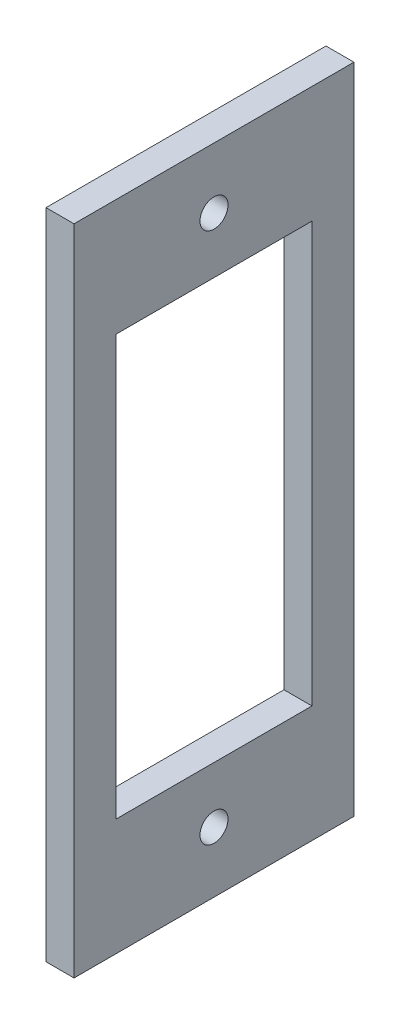
ISO-10303-21;
HEADER;
FILE_DESCRIPTION(('STEP AP214'),'2;1');
FILE_NAME('part.step','',(''),(''),'','','');
FILE_SCHEMA(('AUTOMOTIVE_DESIGN { 1 0 10303 214 1 1 1 1 }'));
ENDSEC;
DATA;
#1=APPLICATION_CONTEXT('core data for automotive mechanical design processes');
#2=APPLICATION_PROTOCOL_DEFINITION('international standard','automotive_design',2000,#1);
#3=PRODUCT_CONTEXT('',#1,'mechanical');
#4=PRODUCT('Part','Part','',(#3));
#5=PRODUCT_RELATED_PRODUCT_CATEGORY('part','',(#4));
#6=PRODUCT_DEFINITION_FORMATION('','',#4);
#7=PRODUCT_DEFINITION_CONTEXT('part definition',#1,'design');
#8=PRODUCT_DEFINITION('design','',#6,#7);
#9=PRODUCT_DEFINITION_SHAPE('','',#8);
#10=(LENGTH_UNIT() NAMED_UNIT(*) SI_UNIT(.MILLI.,.METRE.));
#11=(NAMED_UNIT(*) PLANE_ANGLE_UNIT() SI_UNIT($,.RADIAN.));
#12=(NAMED_UNIT(*) SI_UNIT($,.STERADIAN.) SOLID_ANGLE_UNIT());
#13=UNCERTAINTY_MEASURE_WITH_UNIT(LENGTH_MEASURE(1.E-05),#10,'distance_accuracy_value','');
#14=(GEOMETRIC_REPRESENTATION_CONTEXT(3) GLOBAL_UNCERTAINTY_ASSIGNED_CONTEXT((#13)) GLOBAL_UNIT_ASSIGNED_CONTEXT((#10,
#11,#12)) REPRESENTATION_CONTEXT('',''));
#15=CARTESIAN_POINT('',(0.,0.,0.));
#16=DIRECTION('',(0.,0.,1.));
#17=DIRECTION('',(1.,0.,0.));
#18=AXIS2_PLACEMENT_3D('',#15,#16,#17);
#19=CARTESIAN_POINT('',(3.,-35.,15.));
#20=DIRECTION('',(0.,0.,-1.));
#21=DIRECTION('',(-1.,0.,0.));
#22=AXIS2_PLACEMENT_3D('',#19,#20,#21);
#23=PLANE('',#22);
#24=DIRECTION('',(0.,-1.,0.));
#25=VECTOR('',#24,1.);
#26=CARTESIAN_POINT('',(0.,-35.,15.));
#27=LINE('',#26,#25);
#28=CARTESIAN_POINT('',(0.,35.,15.));
#29=VERTEX_POINT('',#28);
#30=CARTESIAN_POINT('',(0.,-35.,15.));
#31=VERTEX_POINT('',#30);
#32=EDGE_CURVE('E133',#29,#31,#27,.T.);
#33=ORIENTED_EDGE('',*,*,#32,.T.);
#34=DIRECTION('',(-1.,0.,0.));
#35=VECTOR('',#34,1.);
#36=CARTESIAN_POINT('',(3.,-35.,15.));
#37=LINE('',#36,#35);
#38=CARTESIAN_POINT('',(3.,-35.,15.));
#39=VERTEX_POINT('',#38);
#40=EDGE_CURVE('E11',#39,#31,#37,.T.);
#41=ORIENTED_EDGE('',*,*,#40,.F.);
#42=DIRECTION('',(0.,-1.,0.));
#43=VECTOR('',#42,1.);
#44=CARTESIAN_POINT('',(3.,-35.,15.));
#45=LINE('',#44,#43);
#46=CARTESIAN_POINT('',(3.,35.,15.));
#47=VERTEX_POINT('',#46);
#48=EDGE_CURVE('E137',#47,#39,#45,.T.);
#49=ORIENTED_EDGE('',*,*,#48,.F.);
#50=DIRECTION('',(-1.,0.,0.));
#51=VECTOR('',#50,1.);
#52=CARTESIAN_POINT('',(3.,35.,15.));
#53=LINE('',#52,#51);
#54=EDGE_CURVE('E147',#47,#29,#53,.T.);
#55=ORIENTED_EDGE('',*,*,#54,.T.);
#56=EDGE_LOOP('',(#33,#41,#49,#55));
#57=FACE_BOUND('',#56,.T.);
#58=ADVANCED_FACE('F32',(#57),#23,.F.);
#59=CARTESIAN_POINT('',(3.,-35.,-15.));
#60=DIRECTION('',(0.,1.,0.));
#61=DIRECTION('',(0.,0.,1.));
#62=AXIS2_PLACEMENT_3D('',#59,#60,#61);
#63=PLANE('',#62);
#64=DIRECTION('',(0.,0.,-1.));
#65=VECTOR('',#64,1.);
#66=CARTESIAN_POINT('',(0.,-35.,-15.));
#67=LINE('',#66,#65);
#68=CARTESIAN_POINT('',(0.,-35.,-15.));
#69=VERTEX_POINT('',#68);
#70=EDGE_CURVE('E150',#31,#69,#67,.T.);
#71=ORIENTED_EDGE('',*,*,#70,.T.);
#72=DIRECTION('',(-1.,0.,0.));
#73=VECTOR('',#72,1.);
#74=CARTESIAN_POINT('',(3.,-35.,-15.));
#75=LINE('',#74,#73);
#76=CARTESIAN_POINT('',(3.,-35.,-15.));
#77=VERTEX_POINT('',#76);
#78=EDGE_CURVE('E39',#77,#69,#75,.T.);
#79=ORIENTED_EDGE('',*,*,#78,.F.);
#80=DIRECTION('',(0.,0.,-1.));
#81=VECTOR('',#80,1.);
#82=CARTESIAN_POINT('',(3.,-35.,-15.));
#83=LINE('',#82,#81);
#84=EDGE_CURVE('E140',#39,#77,#83,.T.);
#85=ORIENTED_EDGE('',*,*,#84,.F.);
#86=ORIENTED_EDGE('',*,*,#40,.T.);
#87=EDGE_LOOP('',(#71,#79,#85,#86));
#88=FACE_BOUND('',#87,.T.);
#89=ADVANCED_FACE('F178',(#88),#63,.F.);
#90=CARTESIAN_POINT('',(3.,-35.,-15.));
#91=DIRECTION('',(0.,0.,1.));
#92=DIRECTION('',(1.,0.,0.));
#93=AXIS2_PLACEMENT_3D('',#90,#91,#92);
#94=PLANE('',#93);
#95=DIRECTION('',(0.,1.,0.));
#96=VECTOR('',#95,1.);
#97=CARTESIAN_POINT('',(0.,-35.,-15.));
#98=LINE('',#97,#96);
#99=CARTESIAN_POINT('',(0.,35.,-15.));
#100=VERTEX_POINT('',#99);
#101=EDGE_CURVE('E152',#69,#100,#98,.T.);
#102=ORIENTED_EDGE('',*,*,#101,.T.);
#103=DIRECTION('',(-1.,0.,0.));
#104=VECTOR('',#103,1.);
#105=CARTESIAN_POINT('',(3.,35.,-15.));
#106=LINE('',#105,#104);
#107=CARTESIAN_POINT('',(3.,35.,-15.));
#108=VERTEX_POINT('',#107);
#109=EDGE_CURVE('E157',#108,#100,#106,.T.);
#110=ORIENTED_EDGE('',*,*,#109,.F.);
#111=DIRECTION('',(0.,1.,0.));
#112=VECTOR('',#111,1.);
#113=CARTESIAN_POINT('',(3.,-35.,-15.));
#114=LINE('',#113,#112);
#115=EDGE_CURVE('E143',#77,#108,#114,.T.);
#116=ORIENTED_EDGE('',*,*,#115,.F.);
#117=ORIENTED_EDGE('',*,*,#78,.T.);
#118=EDGE_LOOP('',(#102,#110,#116,#117));
#119=FACE_BOUND('',#118,.T.);
#120=ADVANCED_FACE('F164',(#119),#94,.F.);
#121=CARTESIAN_POINT('',(3.,35.,-15.));
#122=DIRECTION('',(0.,-1.,0.));
#123=DIRECTION('',(0.,0.,-1.));
#124=AXIS2_PLACEMENT_3D('',#121,#122,#123);
#125=PLANE('',#124);
#126=DIRECTION('',(0.,0.,1.));
#127=VECTOR('',#126,1.);
#128=CARTESIAN_POINT('',(0.,35.,-15.));
#129=LINE('',#128,#127);
#130=EDGE_CURVE('E141',#100,#29,#129,.T.);
#131=ORIENTED_EDGE('',*,*,#130,.T.);
#132=ORIENTED_EDGE('',*,*,#54,.F.);
#133=DIRECTION('',(0.,0.,1.));
#134=VECTOR('',#133,1.);
#135=CARTESIAN_POINT('',(3.,35.,-15.));
#136=LINE('',#135,#134);
#137=EDGE_CURVE('E145',#108,#47,#136,.T.);
#138=ORIENTED_EDGE('',*,*,#137,.F.);
#139=ORIENTED_EDGE('',*,*,#109,.T.);
#140=EDGE_LOOP('',(#131,#132,#138,#139));
#141=FACE_BOUND('',#140,.T.);
#142=ADVANCED_FACE('F171',(#141),#125,.F.);
#143=CARTESIAN_POINT('',(3.,0.,0.));
#144=DIRECTION('',(1.,0.,0.));
#145=DIRECTION('',(0.,0.,-1.));
#146=AXIS2_PLACEMENT_3D('',#143,#144,#145);
#147=PLANE('',#146);
#148=CARTESIAN_POINT('',(3.,-28.5,0.));
#149=DIRECTION('',(1.,0.,0.));
#150=DIRECTION('',(0.,0.,1.));
#151=AXIS2_PLACEMENT_3D('',#148,#149,#150);
#152=CIRCLE('',#151,1.5);
#153=CARTESIAN_POINT('',(3.,-28.5,1.50000000000001));
#154=VERTEX_POINT('',#153);
#155=EDGE_CURVE('E220',#154,#154,#152,.T.);
#156=ORIENTED_EDGE('',*,*,#155,.F.);
#157=EDGE_LOOP('',(#156));
#158=FACE_BOUND('',#157,.T.);
#159=CARTESIAN_POINT('',(3.,28.5,0.));
#160=DIRECTION('',(1.,0.,0.));
#161=DIRECTION('',(0.,0.,-1.));
#162=AXIS2_PLACEMENT_3D('',#159,#160,#161);
#163=CIRCLE('',#162,1.5);
#164=CARTESIAN_POINT('',(3.,28.5,-1.5));
#165=VERTEX_POINT('',#164);
#166=EDGE_CURVE('E120',#165,#165,#163,.T.);
#167=ORIENTED_EDGE('',*,*,#166,.F.);
#168=EDGE_LOOP('',(#167));
#169=FACE_BOUND('',#168,.T.);
#170=DIRECTION('',(0.,-1.,0.));
#171=VECTOR('',#170,1.);
#172=CARTESIAN_POINT('',(3.,-22.5,10.5));
#173=LINE('',#172,#171);
#174=CARTESIAN_POINT('',(3.,22.5,10.5));
#175=VERTEX_POINT('',#174);
#176=CARTESIAN_POINT('',(3.,-22.5,10.5));
#177=VERTEX_POINT('',#176);
#178=EDGE_CURVE('E46',#175,#177,#173,.T.);
#179=ORIENTED_EDGE('',*,*,#178,.F.);
#180=DIRECTION('',(0.,0.,1.));
#181=VECTOR('',#180,1.);
#182=CARTESIAN_POINT('',(3.,22.5,-10.5));
#183=LINE('',#182,#181);
#184=CARTESIAN_POINT('',(3.,22.5,-10.5));
#185=VERTEX_POINT('',#184);
#186=EDGE_CURVE('E114',#185,#175,#183,.T.);
#187=ORIENTED_EDGE('',*,*,#186,.F.);
#188=DIRECTION('',(0.,1.,0.));
#189=VECTOR('',#188,1.);
#190=CARTESIAN_POINT('',(3.,-22.5,-10.5));
#191=LINE('',#190,#189);
#192=CARTESIAN_POINT('',(3.,-22.5,-10.5));
#193=VERTEX_POINT('',#192);
#194=EDGE_CURVE('E117',#193,#185,#191,.T.);
#195=ORIENTED_EDGE('',*,*,#194,.F.);
#196=DIRECTION('',(0.,0.,-1.));
#197=VECTOR('',#196,1.);
#198=CARTESIAN_POINT('',(3.,-22.5,-10.5));
#199=LINE('',#198,#197);
#200=EDGE_CURVE('E126',#177,#193,#199,.T.);
#201=ORIENTED_EDGE('',*,*,#200,.F.);
#202=EDGE_LOOP('',(#179,#187,#195,#201));
#203=FACE_BOUND('',#202,.T.);
#204=ORIENTED_EDGE('',*,*,#48,.T.);
#205=ORIENTED_EDGE('',*,*,#84,.T.);
#206=ORIENTED_EDGE('',*,*,#115,.T.);
#207=ORIENTED_EDGE('',*,*,#137,.T.);
#208=EDGE_LOOP('',(#204,#205,#206,#207));
#209=FACE_BOUND('',#208,.T.);
#210=ADVANCED_FACE('F177',(#158,#169,#203,#209),#147,.T.);
#211=CARTESIAN_POINT('',(0.,0.,0.));
#212=DIRECTION('',(1.,0.,0.));
#213=DIRECTION('',(0.,0.,-1.));
#214=AXIS2_PLACEMENT_3D('',#211,#212,#213);
#215=PLANE('',#214);
#216=CARTESIAN_POINT('',(0.,-28.5,0.));
#217=DIRECTION('',(1.,0.,0.));
#218=DIRECTION('',(0.,0.,1.));
#219=AXIS2_PLACEMENT_3D('',#216,#217,#218);
#220=CIRCLE('',#219,1.5);
#221=CARTESIAN_POINT('',(0.,-28.5,1.50000000000001));
#222=VERTEX_POINT('',#221);
#223=EDGE_CURVE('E217',#222,#222,#220,.T.);
#224=ORIENTED_EDGE('',*,*,#223,.T.);
#225=EDGE_LOOP('',(#224));
#226=FACE_BOUND('',#225,.T.);
#227=CARTESIAN_POINT('',(0.,28.5,0.));
#228=DIRECTION('',(1.,0.,0.));
#229=DIRECTION('',(0.,0.,-1.));
#230=AXIS2_PLACEMENT_3D('',#227,#228,#229);
#231=CIRCLE('',#230,1.5);
#232=CARTESIAN_POINT('',(0.,28.5,-1.5));
#233=VERTEX_POINT('',#232);
#234=EDGE_CURVE('E127',#233,#233,#231,.T.);
#235=ORIENTED_EDGE('',*,*,#234,.T.);
#236=EDGE_LOOP('',(#235));
#237=FACE_BOUND('',#236,.T.);
#238=DIRECTION('',(0.,0.,1.));
#239=VECTOR('',#238,1.);
#240=CARTESIAN_POINT('',(0.,22.5,-10.5));
#241=LINE('',#240,#239);
#242=CARTESIAN_POINT('',(0.,22.5,-10.5));
#243=VERTEX_POINT('',#242);
#244=CARTESIAN_POINT('',(0.,22.5,10.5));
#245=VERTEX_POINT('',#244);
#246=EDGE_CURVE('E104',#243,#245,#241,.T.);
#247=ORIENTED_EDGE('',*,*,#246,.T.);
#248=DIRECTION('',(0.,-1.,0.));
#249=VECTOR('',#248,1.);
#250=CARTESIAN_POINT('',(0.,-22.5,10.5));
#251=LINE('',#250,#249);
#252=CARTESIAN_POINT('',(0.,-22.5,10.5));
#253=VERTEX_POINT('',#252);
#254=EDGE_CURVE('E98',#245,#253,#251,.T.);
#255=ORIENTED_EDGE('',*,*,#254,.T.);
#256=DIRECTION('',(0.,0.,-1.));
#257=VECTOR('',#256,1.);
#258=CARTESIAN_POINT('',(0.,-22.5,-10.5));
#259=LINE('',#258,#257);
#260=CARTESIAN_POINT('',(0.,-22.5,-10.5));
#261=VERTEX_POINT('',#260);
#262=EDGE_CURVE('E107',#253,#261,#259,.T.);
#263=ORIENTED_EDGE('',*,*,#262,.T.);
#264=DIRECTION('',(0.,1.,0.));
#265=VECTOR('',#264,1.);
#266=CARTESIAN_POINT('',(0.,-22.5,-10.5));
#267=LINE('',#266,#265);
#268=EDGE_CURVE('E54',#261,#243,#267,.T.);
#269=ORIENTED_EDGE('',*,*,#268,.T.);
#270=EDGE_LOOP('',(#247,#255,#263,#269));
#271=FACE_BOUND('',#270,.T.);
#272=ORIENTED_EDGE('',*,*,#32,.F.);
#273=ORIENTED_EDGE('',*,*,#130,.F.);
#274=ORIENTED_EDGE('',*,*,#101,.F.);
#275=ORIENTED_EDGE('',*,*,#70,.F.);
#276=EDGE_LOOP('',(#272,#273,#274,#275));
#277=FACE_BOUND('',#276,.T.);
#278=ADVANCED_FACE('F111',(#226,#237,#271,#277),#215,.F.);
#279=CARTESIAN_POINT('',(0.,-22.5,10.5));
#280=DIRECTION('',(0.,0.,1.));
#281=DIRECTION('',(1.,0.,0.));
#282=AXIS2_PLACEMENT_3D('',#279,#280,#281);
#283=PLANE('',#282);
#284=ORIENTED_EDGE('',*,*,#178,.T.);
#285=DIRECTION('',(1.,0.,0.));
#286=VECTOR('',#285,1.);
#287=CARTESIAN_POINT('',(0.,-22.5,10.5));
#288=LINE('',#287,#286);
#289=EDGE_CURVE('E94',#253,#177,#288,.T.);
#290=ORIENTED_EDGE('',*,*,#289,.F.);
#291=ORIENTED_EDGE('',*,*,#254,.F.);
#292=DIRECTION('',(1.,0.,0.));
#293=VECTOR('',#292,1.);
#294=CARTESIAN_POINT('',(0.,22.5,10.5));
#295=LINE('',#294,#293);
#296=EDGE_CURVE('E131',#245,#175,#295,.T.);
#297=ORIENTED_EDGE('',*,*,#296,.T.);
#298=EDGE_LOOP('',(#284,#290,#291,#297));
#299=FACE_BOUND('',#298,.T.);
#300=ADVANCED_FACE('F96',(#299),#283,.F.);
#301=CARTESIAN_POINT('',(0.,22.5,-10.5));
#302=DIRECTION('',(0.,1.,0.));
#303=DIRECTION('',(0.,0.,1.));
#304=AXIS2_PLACEMENT_3D('',#301,#302,#303);
#305=PLANE('',#304);
#306=ORIENTED_EDGE('',*,*,#186,.T.);
#307=ORIENTED_EDGE('',*,*,#296,.F.);
#308=ORIENTED_EDGE('',*,*,#246,.F.);
#309=DIRECTION('',(1.,0.,0.));
#310=VECTOR('',#309,1.);
#311=CARTESIAN_POINT('',(0.,22.5,-10.5));
#312=LINE('',#311,#310);
#313=EDGE_CURVE('E134',#243,#185,#312,.T.);
#314=ORIENTED_EDGE('',*,*,#313,.T.);
#315=EDGE_LOOP('',(#306,#307,#308,#314));
#316=FACE_BOUND('',#315,.T.);
#317=ADVANCED_FACE('F196',(#316),#305,.F.);
#318=CARTESIAN_POINT('',(0.,-22.5,-10.5));
#319=DIRECTION('',(0.,0.,-1.));
#320=DIRECTION('',(-1.,0.,0.));
#321=AXIS2_PLACEMENT_3D('',#318,#319,#320);
#322=PLANE('',#321);
#323=ORIENTED_EDGE('',*,*,#194,.T.);
#324=ORIENTED_EDGE('',*,*,#313,.F.);
#325=ORIENTED_EDGE('',*,*,#268,.F.);
#326=DIRECTION('',(1.,0.,0.));
#327=VECTOR('',#326,1.);
#328=CARTESIAN_POINT('',(0.,-22.5,-10.5));
#329=LINE('',#328,#327);
#330=EDGE_CURVE('E103',#261,#193,#329,.T.);
#331=ORIENTED_EDGE('',*,*,#330,.T.);
#332=EDGE_LOOP('',(#323,#324,#325,#331));
#333=FACE_BOUND('',#332,.T.);
#334=ADVANCED_FACE('F200',(#333),#322,.F.);
#335=CARTESIAN_POINT('',(0.,-22.5,-10.5));
#336=DIRECTION('',(0.,-1.,0.));
#337=DIRECTION('',(0.,0.,-1.));
#338=AXIS2_PLACEMENT_3D('',#335,#336,#337);
#339=PLANE('',#338);
#340=ORIENTED_EDGE('',*,*,#200,.T.);
#341=ORIENTED_EDGE('',*,*,#330,.F.);
#342=ORIENTED_EDGE('',*,*,#262,.F.);
#343=ORIENTED_EDGE('',*,*,#289,.T.);
#344=EDGE_LOOP('',(#340,#341,#342,#343));
#345=FACE_BOUND('',#344,.T.);
#346=ADVANCED_FACE('F108',(#345),#339,.F.);
#347=CARTESIAN_POINT('',(0.,28.5,0.));
#348=DIRECTION('',(1.,0.,0.));
#349=DIRECTION('',(0.,0.,-1.));
#350=AXIS2_PLACEMENT_3D('',#347,#348,#349);
#351=CYLINDRICAL_SURFACE('',#350,1.5);
#352=ORIENTED_EDGE('',*,*,#234,.F.);
#353=EDGE_LOOP('',(#352));
#354=FACE_BOUND('',#353,.T.);
#355=ORIENTED_EDGE('',*,*,#166,.T.);
#356=EDGE_LOOP('',(#355));
#357=FACE_BOUND('',#356,.T.);
#358=ADVANCED_FACE('F199',(#354,#357),#351,.F.);
#359=CARTESIAN_POINT('',(0.,-28.5,0.));
#360=DIRECTION('',(1.,0.,0.));
#361=DIRECTION('',(0.,0.,-1.));
#362=AXIS2_PLACEMENT_3D('',#359,#360,#361);
#363=CYLINDRICAL_SURFACE('',#362,1.5);
#364=ORIENTED_EDGE('',*,*,#223,.F.);
#365=EDGE_LOOP('',(#364));
#366=FACE_BOUND('',#365,.T.);
#367=ORIENTED_EDGE('',*,*,#155,.T.);
#368=EDGE_LOOP('',(#367));
#369=FACE_BOUND('',#368,.T.);
#370=ADVANCED_FACE('F208',(#366,#369),#363,.F.);
#371=CLOSED_SHELL('',(#58,#89,#120,#142,#210,#278,#300,#317,#334,#346,#358,#370));
#372=MANIFOLD_SOLID_BREP('B2',#371);
#373=ADVANCED_BREP_SHAPE_REPRESENTATION('',(#18,#372),#14);
#374=SHAPE_DEFINITION_REPRESENTATION(#9,#373);
ENDSEC;
END-ISO-10303-21;
